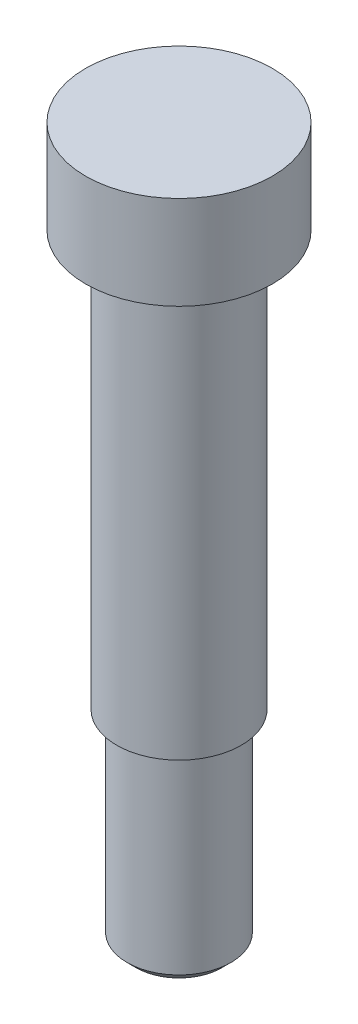
ISO-10303-21;
HEADER;
FILE_DESCRIPTION(('STEP AP214'),'2;1');
FILE_NAME('part.step','',(''),(''),'','','');
FILE_SCHEMA(('AUTOMOTIVE_DESIGN { 1 0 10303 214 1 1 1 1 }'));
ENDSEC;
DATA;
#1=APPLICATION_CONTEXT('core data for automotive mechanical design processes');
#2=APPLICATION_PROTOCOL_DEFINITION('international standard','automotive_design',2000,#1);
#3=PRODUCT_CONTEXT('',#1,'mechanical');
#4=PRODUCT('Part','Part','',(#3));
#5=PRODUCT_RELATED_PRODUCT_CATEGORY('part','',(#4));
#6=PRODUCT_DEFINITION_FORMATION('','',#4);
#7=PRODUCT_DEFINITION_CONTEXT('part definition',#1,'design');
#8=PRODUCT_DEFINITION('design','',#6,#7);
#9=PRODUCT_DEFINITION_SHAPE('','',#8);
#10=(LENGTH_UNIT() NAMED_UNIT(*) SI_UNIT(.MILLI.,.METRE.));
#11=(NAMED_UNIT(*) PLANE_ANGLE_UNIT() SI_UNIT($,.RADIAN.));
#12=(NAMED_UNIT(*) SI_UNIT($,.STERADIAN.) SOLID_ANGLE_UNIT());
#13=UNCERTAINTY_MEASURE_WITH_UNIT(LENGTH_MEASURE(1.E-05),#10,'distance_accuracy_value','');
#14=(GEOMETRIC_REPRESENTATION_CONTEXT(3) GLOBAL_UNCERTAINTY_ASSIGNED_CONTEXT((#13)) GLOBAL_UNIT_ASSIGNED_CONTEXT((#10,
#11,#12)) REPRESENTATION_CONTEXT('',''));
#15=CARTESIAN_POINT('',(0.,0.,0.));
#16=DIRECTION('',(0.,0.,1.));
#17=DIRECTION('',(1.,0.,0.));
#18=AXIS2_PLACEMENT_3D('',#15,#16,#17);
#19=CARTESIAN_POINT('',(0.,34.25,0.));
#20=DIRECTION('',(0.,1.,0.));
#21=DIRECTION('',(0.,0.,1.));
#22=AXIS2_PLACEMENT_3D('',#19,#20,#21);
#23=PLANE('',#22);
#24=CARTESIAN_POINT('',(0.,34.25,0.));
#25=DIRECTION('',(0.,-1.,0.));
#26=DIRECTION('',(0.,0.,-1.));
#27=AXIS2_PLACEMENT_3D('',#24,#25,#26);
#28=CIRCLE('',#27,4.5);
#29=CARTESIAN_POINT('',(0.,34.25,-4.5));
#30=VERTEX_POINT('',#29);
#31=EDGE_CURVE('E10',#30,#30,#28,.T.);
#32=ORIENTED_EDGE('',*,*,#31,.F.);
#33=EDGE_LOOP('',(#32));
#34=FACE_BOUND('',#33,.T.);
#35=ADVANCED_FACE('F39',(#34),#23,.T.);
#36=CARTESIAN_POINT('',(0.,0.,0.));
#37=DIRECTION('',(0.,-1.,0.));
#38=DIRECTION('',(0.,0.,-1.));
#39=AXIS2_PLACEMENT_3D('',#36,#37,#38);
#40=CYLINDRICAL_SURFACE('',#39,4.5);
#41=ORIENTED_EDGE('',*,*,#31,.T.);
#42=EDGE_LOOP('',(#41));
#43=FACE_BOUND('',#42,.T.);
#44=CARTESIAN_POINT('',(0.,29.75,0.));
#45=DIRECTION('',(0.,-1.,0.));
#46=DIRECTION('',(0.,0.,-1.));
#47=AXIS2_PLACEMENT_3D('',#44,#45,#46);
#48=CIRCLE('',#47,4.5);
#49=CARTESIAN_POINT('',(0.,29.75,-4.5));
#50=VERTEX_POINT('',#49);
#51=EDGE_CURVE('E46',#50,#50,#48,.T.);
#52=ORIENTED_EDGE('',*,*,#51,.F.);
#53=EDGE_LOOP('',(#52));
#54=FACE_BOUND('',#53,.T.);
#55=ADVANCED_FACE('F81',(#43,#54),#40,.T.);
#56=CARTESIAN_POINT('',(4.5,29.75,0.));
#57=DIRECTION('',(0.,-1.,0.));
#58=DIRECTION('',(0.,0.,-1.));
#59=AXIS2_PLACEMENT_3D('',#56,#57,#58);
#60=PLANE('',#59);
#61=ORIENTED_EDGE('',*,*,#51,.T.);
#62=EDGE_LOOP('',(#61));
#63=FACE_BOUND('',#62,.T.);
#64=CARTESIAN_POINT('',(0.,29.75,0.));
#65=DIRECTION('',(0.,-1.,0.));
#66=DIRECTION('',(0.,0.,-1.));
#67=AXIS2_PLACEMENT_3D('',#64,#65,#66);
#68=CIRCLE('',#67,3.);
#69=CARTESIAN_POINT('',(0.,29.75,-3.));
#70=VERTEX_POINT('',#69);
#71=EDGE_CURVE('E50',#70,#70,#68,.T.);
#72=ORIENTED_EDGE('',*,*,#71,.F.);
#73=EDGE_LOOP('',(#72));
#74=FACE_BOUND('',#73,.T.);
#75=ADVANCED_FACE('F86',(#63,#74),#60,.T.);
#76=CARTESIAN_POINT('',(0.,0.,0.));
#77=DIRECTION('',(0.,-1.,0.));
#78=DIRECTION('',(0.,0.,-1.));
#79=AXIS2_PLACEMENT_3D('',#76,#77,#78);
#80=CYLINDRICAL_SURFACE('',#79,3.);
#81=ORIENTED_EDGE('',*,*,#71,.T.);
#82=EDGE_LOOP('',(#81));
#83=FACE_BOUND('',#82,.T.);
#84=CARTESIAN_POINT('',(0.,9.75,0.));
#85=DIRECTION('',(0.,-1.,0.));
#86=DIRECTION('',(0.,0.,-1.));
#87=AXIS2_PLACEMENT_3D('',#84,#85,#86);
#88=CIRCLE('',#87,3.);
#89=CARTESIAN_POINT('',(0.,9.75,-3.));
#90=VERTEX_POINT('',#89);
#91=EDGE_CURVE('E54',#90,#90,#88,.T.);
#92=ORIENTED_EDGE('',*,*,#91,.F.);
#93=EDGE_LOOP('',(#92));
#94=FACE_BOUND('',#93,.T.);
#95=ADVANCED_FACE('F91',(#83,#94),#80,.T.);
#96=CARTESIAN_POINT('',(3.,9.75,0.));
#97=DIRECTION('',(0.,-1.,0.));
#98=DIRECTION('',(0.,0.,-1.));
#99=AXIS2_PLACEMENT_3D('',#96,#97,#98);
#100=PLANE('',#99);
#101=ORIENTED_EDGE('',*,*,#91,.T.);
#102=EDGE_LOOP('',(#101));
#103=FACE_BOUND('',#102,.T.);
#104=CARTESIAN_POINT('',(0.,9.75,0.));
#105=DIRECTION('',(0.,1.,0.));
#106=DIRECTION('',(0.,0.,1.));
#107=AXIS2_PLACEMENT_3D('',#104,#105,#106);
#108=CIRCLE('',#107,2.5);
#109=CARTESIAN_POINT('',(0.,9.75,2.5));
#110=VERTEX_POINT('',#109);
#111=EDGE_CURVE('E59',#110,#110,#108,.T.);
#112=ORIENTED_EDGE('',*,*,#111,.T.);
#113=EDGE_LOOP('',(#112));
#114=FACE_BOUND('',#113,.T.);
#115=ADVANCED_FACE('F94',(#103,#114),#100,.T.);
#116=CARTESIAN_POINT('',(0.,0.,0.));
#117=DIRECTION('',(0.,1.,0.));
#118=DIRECTION('',(0.,0.,1.));
#119=AXIS2_PLACEMENT_3D('',#116,#117,#118);
#120=CYLINDRICAL_SURFACE('',#119,2.5);
#121=ORIENTED_EDGE('',*,*,#111,.F.);
#122=EDGE_LOOP('',(#121));
#123=FACE_BOUND('',#122,.T.);
#124=CARTESIAN_POINT('',(0.,0.432999999999998,0.));
#125=DIRECTION('',(0.,1.,0.));
#126=DIRECTION('',(0.,0.,1.));
#127=AXIS2_PLACEMENT_3D('',#124,#125,#126);
#128=CIRCLE('',#127,2.5);
#129=CARTESIAN_POINT('',(0.,0.432999999999998,2.5));
#130=VERTEX_POINT('',#129);
#131=EDGE_CURVE('E65',#130,#130,#128,.T.);
#132=ORIENTED_EDGE('',*,*,#131,.T.);
#133=EDGE_LOOP('',(#132));
#134=FACE_BOUND('',#133,.T.);
#135=ADVANCED_FACE('F69',(#123,#134),#120,.T.);
#136=CARTESIAN_POINT('',(0.,0.,0.));
#137=DIRECTION('',(0.,1.,0.));
#138=DIRECTION('',(0.,0.,1.));
#139=AXIS2_PLACEMENT_3D('',#136,#137,#138);
#140=CONICAL_SURFACE('',#139,2.067,0.785398163397449);
#141=ORIENTED_EDGE('',*,*,#131,.F.);
#142=EDGE_LOOP('',(#141));
#143=FACE_BOUND('',#142,.T.);
#144=CARTESIAN_POINT('',(0.,0.,0.));
#145=DIRECTION('',(0.,1.,0.));
#146=DIRECTION('',(0.,0.,1.));
#147=AXIS2_PLACEMENT_3D('',#144,#145,#146);
#148=CIRCLE('',#147,2.067);
#149=CARTESIAN_POINT('',(0.,0.,2.067));
#150=VERTEX_POINT('',#149);
#151=EDGE_CURVE('E62',#150,#150,#148,.T.);
#152=ORIENTED_EDGE('',*,*,#151,.T.);
#153=EDGE_LOOP('',(#152));
#154=FACE_BOUND('',#153,.T.);
#155=ADVANCED_FACE('F71',(#143,#154),#140,.T.);
#156=CARTESIAN_POINT('',(2.8,0.,0.));
#157=DIRECTION('',(0.,-1.,0.));
#158=DIRECTION('',(0.,0.,-1.));
#159=AXIS2_PLACEMENT_3D('',#156,#157,#158);
#160=PLANE('',#159);
#161=ORIENTED_EDGE('',*,*,#151,.F.);
#162=EDGE_LOOP('',(#161));
#163=FACE_BOUND('',#162,.T.);
#164=ADVANCED_FACE('F41',(#163),#160,.T.);
#165=CLOSED_SHELL('',(#35,#55,#75,#95,#115,#135,#155,#164));
#166=MANIFOLD_SOLID_BREP('B2',#165);
#167=ADVANCED_BREP_SHAPE_REPRESENTATION('',(#18,#166),#14);
#168=SHAPE_DEFINITION_REPRESENTATION(#9,#167);
ENDSEC;
END-ISO-10303-21;
